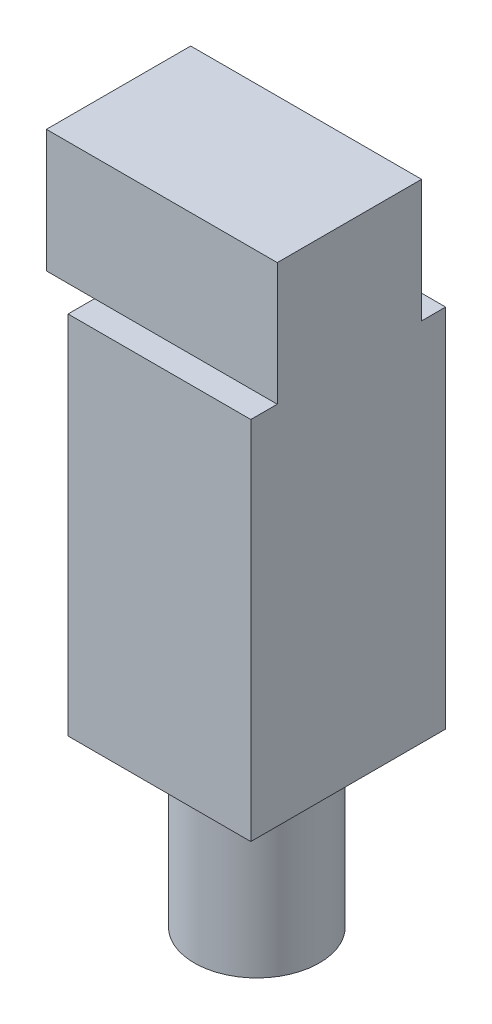
ISO-10303-21;
HEADER;
FILE_DESCRIPTION(('STEP AP214'),'2;1');
FILE_NAME('part.step','',(''),(''),'','','');
FILE_SCHEMA(('AUTOMOTIVE_DESIGN { 1 0 10303 214 1 1 1 1 }'));
ENDSEC;
DATA;
#1=APPLICATION_CONTEXT('core data for automotive mechanical design processes');
#2=APPLICATION_PROTOCOL_DEFINITION('international standard','automotive_design',2000,#1);
#3=PRODUCT_CONTEXT('',#1,'mechanical');
#4=PRODUCT('Part','Part','',(#3));
#5=PRODUCT_RELATED_PRODUCT_CATEGORY('part','',(#4));
#6=PRODUCT_DEFINITION_FORMATION('','',#4);
#7=PRODUCT_DEFINITION_CONTEXT('part definition',#1,'design');
#8=PRODUCT_DEFINITION('design','',#6,#7);
#9=PRODUCT_DEFINITION_SHAPE('','',#8);
#10=(LENGTH_UNIT() NAMED_UNIT(*) SI_UNIT(.MILLI.,.METRE.));
#11=(NAMED_UNIT(*) PLANE_ANGLE_UNIT() SI_UNIT($,.RADIAN.));
#12=(NAMED_UNIT(*) SI_UNIT($,.STERADIAN.) SOLID_ANGLE_UNIT());
#13=UNCERTAINTY_MEASURE_WITH_UNIT(LENGTH_MEASURE(1.E-05),#10,'distance_accuracy_value','');
#14=(GEOMETRIC_REPRESENTATION_CONTEXT(3) GLOBAL_UNCERTAINTY_ASSIGNED_CONTEXT((#13)) GLOBAL_UNIT_ASSIGNED_CONTEXT((#10,
#11,#12)) REPRESENTATION_CONTEXT('',''));
#15=CARTESIAN_POINT('',(0.,0.,0.));
#16=DIRECTION('',(0.,0.,1.));
#17=DIRECTION('',(1.,0.,0.));
#18=AXIS2_PLACEMENT_3D('',#15,#16,#17);
#19=CARTESIAN_POINT('',(19.0000000000004,38.,20.2499999999998));
#20=DIRECTION('',(0.,-1.,0.));
#21=DIRECTION('',(0.,0.,-1.));
#22=AXIS2_PLACEMENT_3D('',#19,#20,#21);
#23=PLANE('',#22);
#24=DIRECTION('',(-1.,0.,0.));
#25=VECTOR('',#24,1.);
#26=CARTESIAN_POINT('',(19.0000000000003,38.,-15.25));
#27=LINE('',#26,#25);
#28=CARTESIAN_POINT('',(19.0000000000003,38.,-15.25));
#29=VERTEX_POINT('',#28);
#30=CARTESIAN_POINT('',(-19.,38.000000000002,-15.25));
#31=VERTEX_POINT('',#30);
#32=EDGE_CURVE('E195',#29,#31,#27,.T.);
#33=ORIENTED_EDGE('',*,*,#32,.F.);
#34=DIRECTION('',(0.,0.,1.));
#35=VECTOR('',#34,1.);
#36=CARTESIAN_POINT('',(19.0000000000004,38.,20.2499999999998));
#37=LINE('',#36,#35);
#38=CARTESIAN_POINT('',(19.0000000000003,38.,-20.25));
#39=VERTEX_POINT('',#38);
#40=EDGE_CURVE('E104',#39,#29,#37,.T.);
#41=ORIENTED_EDGE('',*,*,#40,.F.);
#42=DIRECTION('',(-1.,0.,0.));
#43=VECTOR('',#42,1.);
#44=CARTESIAN_POINT('',(19.0000000000003,38.,-20.25));
#45=LINE('',#44,#43);
#46=CARTESIAN_POINT('',(-19.,38.000000000002,-20.25));
#47=VERTEX_POINT('',#46);
#48=EDGE_CURVE('E54',#39,#47,#45,.T.);
#49=ORIENTED_EDGE('',*,*,#48,.T.);
#50=DIRECTION('',(0.,0.,1.));
#51=VECTOR('',#50,1.);
#52=CARTESIAN_POINT('',(-19.,38.000000000002,20.25));
#53=LINE('',#52,#51);
#54=EDGE_CURVE('E167',#47,#31,#53,.T.);
#55=ORIENTED_EDGE('',*,*,#54,.T.);
#56=EDGE_LOOP('',(#33,#41,#49,#55));
#57=FACE_BOUND('',#56,.T.);
#58=ADVANCED_FACE('F50',(#57),#23,.F.);
#59=CARTESIAN_POINT('',(19.0000000000005,-38.,-20.25));
#60=DIRECTION('',(0.,0.,1.));
#61=DIRECTION('',(1.,0.,0.));
#62=AXIS2_PLACEMENT_3D('',#59,#60,#61);
#63=PLANE('',#62);
#64=DIRECTION('',(0.,1.,0.));
#65=VECTOR('',#64,1.);
#66=CARTESIAN_POINT('',(-18.9999999999999,-37.999999999998,-20.25));
#67=LINE('',#66,#65);
#68=CARTESIAN_POINT('',(-18.9999999999999,-37.999999999998,-20.25));
#69=VERTEX_POINT('',#68);
#70=EDGE_CURVE('E162',#69,#47,#67,.T.);
#71=ORIENTED_EDGE('',*,*,#70,.T.);
#72=ORIENTED_EDGE('',*,*,#48,.F.);
#73=DIRECTION('',(0.,1.,0.));
#74=VECTOR('',#73,1.);
#75=CARTESIAN_POINT('',(19.0000000000005,-38.,-20.25));
#76=LINE('',#75,#74);
#77=CARTESIAN_POINT('',(19.0000000000005,-38.,-20.25));
#78=VERTEX_POINT('',#77);
#79=EDGE_CURVE('E154',#78,#39,#76,.T.);
#80=ORIENTED_EDGE('',*,*,#79,.F.);
#81=DIRECTION('',(-1.,0.,0.));
#82=VECTOR('',#81,1.);
#83=CARTESIAN_POINT('',(19.0000000000005,-38.,-20.25));
#84=LINE('',#83,#82);
#85=EDGE_CURVE('E161',#78,#69,#84,.T.);
#86=ORIENTED_EDGE('',*,*,#85,.T.);
#87=EDGE_LOOP('',(#71,#72,#80,#86));
#88=FACE_BOUND('',#87,.T.);
#89=ADVANCED_FACE('F52',(#88),#63,.F.);
#90=CARTESIAN_POINT('',(19.0000000000004,38.,14.7499999999998));
#91=VERTEX_POINT('',#90);
#92=CARTESIAN_POINT('',(19.0000000000004,38.,20.2499999999998));
#93=VERTEX_POINT('',#92);
#94=EDGE_CURVE('E144',#91,#93,#37,.T.);
#95=ORIENTED_EDGE('',*,*,#94,.F.);
#96=DIRECTION('',(-1.,0.,0.));
#97=VECTOR('',#96,1.);
#98=CARTESIAN_POINT('',(19.0000000000004,38.,14.7499999999998));
#99=LINE('',#98,#97);
#100=CARTESIAN_POINT('',(-19.,38.000000000002,14.75));
#101=VERTEX_POINT('',#100);
#102=EDGE_CURVE('E132',#91,#101,#99,.T.);
#103=ORIENTED_EDGE('',*,*,#102,.T.);
#104=CARTESIAN_POINT('',(-19.,38.000000000002,20.25));
#105=VERTEX_POINT('',#104);
#106=EDGE_CURVE('E165',#101,#105,#53,.T.);
#107=ORIENTED_EDGE('',*,*,#106,.T.);
#108=DIRECTION('',(-1.,0.,0.));
#109=VECTOR('',#108,1.);
#110=CARTESIAN_POINT('',(19.0000000000004,38.,20.2499999999998));
#111=LINE('',#110,#109);
#112=EDGE_CURVE('E152',#93,#105,#111,.T.);
#113=ORIENTED_EDGE('',*,*,#112,.F.);
#114=EDGE_LOOP('',(#95,#103,#107,#113));
#115=FACE_BOUND('',#114,.T.);
#116=ADVANCED_FACE('F150',(#115),#23,.F.);
#117=CARTESIAN_POINT('',(19.0000000000002,-38.,20.2499999999995));
#118=DIRECTION('',(0.,0.,-1.));
#119=DIRECTION('',(-1.,0.,0.));
#120=AXIS2_PLACEMENT_3D('',#117,#118,#119);
#121=PLANE('',#120);
#122=DIRECTION('',(0.,-1.,0.));
#123=VECTOR('',#122,1.);
#124=CARTESIAN_POINT('',(-19.,-37.999999999998,20.2499999999997));
#125=LINE('',#124,#123);
#126=CARTESIAN_POINT('',(-19.,-37.999999999998,20.2499999999997));
#127=VERTEX_POINT('',#126);
#128=EDGE_CURVE('E170',#105,#127,#125,.T.);
#129=ORIENTED_EDGE('',*,*,#128,.T.);
#130=DIRECTION('',(-1.,0.,0.));
#131=VECTOR('',#130,1.);
#132=CARTESIAN_POINT('',(19.0000000000002,-38.,20.2499999999995));
#133=LINE('',#132,#131);
#134=CARTESIAN_POINT('',(19.0000000000002,-38.,20.2499999999995));
#135=VERTEX_POINT('',#134);
#136=EDGE_CURVE('E175',#135,#127,#133,.T.);
#137=ORIENTED_EDGE('',*,*,#136,.F.);
#138=DIRECTION('',(0.,-1.,0.));
#139=VECTOR('',#138,1.);
#140=CARTESIAN_POINT('',(19.0000000000002,-38.,20.2499999999995));
#141=LINE('',#140,#139);
#142=EDGE_CURVE('E156',#93,#135,#141,.T.);
#143=ORIENTED_EDGE('',*,*,#142,.F.);
#144=ORIENTED_EDGE('',*,*,#112,.T.);
#145=EDGE_LOOP('',(#129,#137,#143,#144));
#146=FACE_BOUND('',#145,.T.);
#147=ADVANCED_FACE('F224',(#146),#121,.F.);
#148=CARTESIAN_POINT('',(19.0000000000002,-38.,20.2499999999995));
#149=DIRECTION('',(0.,1.,0.));
#150=DIRECTION('',(0.,0.,1.));
#151=AXIS2_PLACEMENT_3D('',#148,#149,#150);
#152=PLANE('',#151);
#153=CARTESIAN_POINT('',(0.,-38.,0.));
#154=DIRECTION('',(0.,-1.,0.));
#155=DIRECTION('',(0.,0.,-1.));
#156=AXIS2_PLACEMENT_3D('',#153,#154,#155);
#157=CIRCLE('',#156,13.);
#158=CARTESIAN_POINT('',(0.,-38.0000000000001,-13.));
#159=VERTEX_POINT('',#158);
#160=EDGE_CURVE('E13',#159,#159,#157,.T.);
#161=ORIENTED_EDGE('',*,*,#160,.F.);
#162=EDGE_LOOP('',(#161));
#163=FACE_BOUND('',#162,.T.);
#164=DIRECTION('',(0.,0.,-1.));
#165=VECTOR('',#164,1.);
#166=CARTESIAN_POINT('',(-19.,-37.999999999998,20.2499999999997));
#167=LINE('',#166,#165);
#168=EDGE_CURVE('E96',#127,#69,#167,.T.);
#169=ORIENTED_EDGE('',*,*,#168,.T.);
#170=ORIENTED_EDGE('',*,*,#85,.F.);
#171=DIRECTION('',(0.,0.,-1.));
#172=VECTOR('',#171,1.);
#173=CARTESIAN_POINT('',(19.0000000000002,-38.,20.2499999999995));
#174=LINE('',#173,#172);
#175=EDGE_CURVE('E75',#135,#78,#174,.T.);
#176=ORIENTED_EDGE('',*,*,#175,.F.);
#177=ORIENTED_EDGE('',*,*,#136,.T.);
#178=EDGE_LOOP('',(#169,#170,#176,#177));
#179=FACE_BOUND('',#178,.T.);
#180=ADVANCED_FACE('F222',(#163,#179),#152,.F.);
#181=CARTESIAN_POINT('',(19.0000000000003,0.,0.));
#182=DIRECTION('',(-1.,0.,0.));
#183=DIRECTION('',(0.,0.,1.));
#184=AXIS2_PLACEMENT_3D('',#181,#182,#183);
#185=PLANE('',#184);
#186=ORIENTED_EDGE('',*,*,#79,.T.);
#187=ORIENTED_EDGE('',*,*,#40,.T.);
#188=DIRECTION('',(0.,-1.,0.));
#189=VECTOR('',#188,1.);
#190=CARTESIAN_POINT('',(19.0000000000003,38.,-15.25));
#191=LINE('',#190,#189);
#192=CARTESIAN_POINT('',(19.0000000000002,63.5000000000001,-15.25));
#193=VERTEX_POINT('',#192);
#194=EDGE_CURVE('E196',#193,#29,#191,.T.);
#195=ORIENTED_EDGE('',*,*,#194,.F.);
#196=DIRECTION('',(0.,0.,-1.));
#197=VECTOR('',#196,1.);
#198=CARTESIAN_POINT('',(19.0000000000003,63.5000000000001,14.75));
#199=LINE('',#198,#197);
#200=CARTESIAN_POINT('',(19.0000000000003,63.5000000000001,14.75));
#201=VERTEX_POINT('',#200);
#202=EDGE_CURVE('E147',#201,#193,#199,.T.);
#203=ORIENTED_EDGE('',*,*,#202,.F.);
#204=DIRECTION('',(0.,-1.,0.));
#205=VECTOR('',#204,1.);
#206=CARTESIAN_POINT('',(19.0000000000004,38.,14.7499999999998));
#207=LINE('',#206,#205);
#208=EDGE_CURVE('E136',#201,#91,#207,.T.);
#209=ORIENTED_EDGE('',*,*,#208,.T.);
#210=ORIENTED_EDGE('',*,*,#94,.T.);
#211=ORIENTED_EDGE('',*,*,#142,.T.);
#212=ORIENTED_EDGE('',*,*,#175,.T.);
#213=EDGE_LOOP('',(#186,#187,#195,#203,#209,#210,#211,#212));
#214=FACE_BOUND('',#213,.T.);
#215=ADVANCED_FACE('F143',(#214),#185,.F.);
#216=CARTESIAN_POINT('',(-19.,1.99840144432528E-12,0.));
#217=DIRECTION('',(-1.,0.,0.));
#218=DIRECTION('',(0.,0.,1.));
#219=AXIS2_PLACEMENT_3D('',#216,#217,#218);
#220=PLANE('',#219);
#221=ORIENTED_EDGE('',*,*,#70,.F.);
#222=ORIENTED_EDGE('',*,*,#168,.F.);
#223=ORIENTED_EDGE('',*,*,#128,.F.);
#224=ORIENTED_EDGE('',*,*,#106,.F.);
#225=EDGE_CURVE('E171',#31,#101,#53,.T.);
#226=ORIENTED_EDGE('',*,*,#225,.F.);
#227=ORIENTED_EDGE('',*,*,#54,.F.);
#228=EDGE_LOOP('',(#221,#222,#223,#224,#226,#227));
#229=FACE_BOUND('',#228,.T.);
#230=ADVANCED_FACE('F183',(#229),#220,.T.);
#231=CARTESIAN_POINT('',(0.,-73.,0.));
#232=DIRECTION('',(0.,1.,0.));
#233=DIRECTION('',(0.,0.,1.));
#234=AXIS2_PLACEMENT_3D('',#231,#232,#233);
#235=CYLINDRICAL_SURFACE('',#234,13.);
#236=CARTESIAN_POINT('',(0.,-73.,0.));
#237=DIRECTION('',(0.,-1.,0.));
#238=DIRECTION('',(0.,0.,-1.));
#239=AXIS2_PLACEMENT_3D('',#236,#237,#238);
#240=CIRCLE('',#239,13.);
#241=CARTESIAN_POINT('',(0.,-73.,-13.));
#242=VERTEX_POINT('',#241);
#243=EDGE_CURVE('E166',#242,#242,#240,.T.);
#244=ORIENTED_EDGE('',*,*,#243,.F.);
#245=EDGE_LOOP('',(#244));
#246=FACE_BOUND('',#245,.T.);
#247=ORIENTED_EDGE('',*,*,#160,.T.);
#248=EDGE_LOOP('',(#247));
#249=FACE_BOUND('',#248,.T.);
#250=ADVANCED_FACE('F216',(#246,#249),#235,.T.);
#251=CARTESIAN_POINT('',(0.,-73.,0.));
#252=DIRECTION('',(0.,-1.,0.));
#253=DIRECTION('',(0.,0.,-1.));
#254=AXIS2_PLACEMENT_3D('',#251,#252,#253);
#255=PLANE('',#254);
#256=ORIENTED_EDGE('',*,*,#243,.T.);
#257=EDGE_LOOP('',(#256));
#258=FACE_BOUND('',#257,.T.);
#259=ADVANCED_FACE('F214',(#258),#255,.T.);
#260=CARTESIAN_POINT('',(19.0000000000003,63.5000000000001,14.75));
#261=DIRECTION('',(0.,1.,0.));
#262=DIRECTION('',(0.,0.,1.));
#263=AXIS2_PLACEMENT_3D('',#260,#261,#262);
#264=PLANE('',#263);
#265=DIRECTION('',(1.,0.,0.));
#266=VECTOR('',#265,1.);
#267=CARTESIAN_POINT('',(19.0000000000002,63.5000000000001,-15.25));
#268=LINE('',#267,#266);
#269=CARTESIAN_POINT('',(-29.,63.5000000000019,-15.25));
#270=VERTEX_POINT('',#269);
#271=EDGE_CURVE('E148',#270,#193,#268,.T.);
#272=ORIENTED_EDGE('',*,*,#271,.F.);
#273=DIRECTION('',(0.,0.,-1.));
#274=VECTOR('',#273,1.);
#275=CARTESIAN_POINT('',(-29.,63.5000000000019,14.75));
#276=LINE('',#275,#274);
#277=CARTESIAN_POINT('',(-29.,63.5000000000019,14.75));
#278=VERTEX_POINT('',#277);
#279=EDGE_CURVE('E207',#278,#270,#276,.T.);
#280=ORIENTED_EDGE('',*,*,#279,.F.);
#281=DIRECTION('',(1.,0.,0.));
#282=VECTOR('',#281,1.);
#283=CARTESIAN_POINT('',(19.0000000000003,63.5000000000001,14.75));
#284=LINE('',#283,#282);
#285=EDGE_CURVE('E210',#278,#201,#284,.T.);
#286=ORIENTED_EDGE('',*,*,#285,.T.);
#287=ORIENTED_EDGE('',*,*,#202,.T.);
#288=EDGE_LOOP('',(#272,#280,#286,#287));
#289=FACE_BOUND('',#288,.T.);
#290=ADVANCED_FACE('F270',(#289),#264,.T.);
#291=CARTESIAN_POINT('',(-29.,38.0000000000018,14.75));
#292=DIRECTION('',(-1.,0.,0.));
#293=DIRECTION('',(0.,-1.,0.));
#294=AXIS2_PLACEMENT_3D('',#291,#292,#293);
#295=PLANE('',#294);
#296=CARTESIAN_POINT('',(-29.,53.5000000000019,0.));
#297=DIRECTION('',(-1.,0.,0.));
#298=DIRECTION('',(0.,-1.,0.));
#299=AXIS2_PLACEMENT_3D('',#296,#297,#298);
#300=CIRCLE('',#299,4.5);
#301=CARTESIAN_POINT('',(-29.,49.0000000000019,0.));
#302=VERTEX_POINT('',#301);
#303=EDGE_CURVE('E326',#302,#302,#300,.T.);
#304=ORIENTED_EDGE('',*,*,#303,.F.);
#305=EDGE_LOOP('',(#304));
#306=FACE_BOUND('',#305,.T.);
#307=DIRECTION('',(0.,1.,0.));
#308=VECTOR('',#307,1.);
#309=CARTESIAN_POINT('',(-29.,38.0000000000018,-15.25));
#310=LINE('',#309,#308);
#311=CARTESIAN_POINT('',(-29.,38.0000000000018,-15.25));
#312=VERTEX_POINT('',#311);
#313=EDGE_CURVE('E200',#312,#270,#310,.T.);
#314=ORIENTED_EDGE('',*,*,#313,.F.);
#315=DIRECTION('',(0.,0.,-1.));
#316=VECTOR('',#315,1.);
#317=CARTESIAN_POINT('',(-29.,38.0000000000018,14.75));
#318=LINE('',#317,#316);
#319=CARTESIAN_POINT('',(-29.,38.0000000000018,14.75));
#320=VERTEX_POINT('',#319);
#321=EDGE_CURVE('E191',#320,#312,#318,.T.);
#322=ORIENTED_EDGE('',*,*,#321,.F.);
#323=DIRECTION('',(0.,1.,0.));
#324=VECTOR('',#323,1.);
#325=CARTESIAN_POINT('',(-29.,38.0000000000018,14.75));
#326=LINE('',#325,#324);
#327=EDGE_CURVE('E141',#320,#278,#326,.T.);
#328=ORIENTED_EDGE('',*,*,#327,.T.);
#329=ORIENTED_EDGE('',*,*,#279,.T.);
#330=EDGE_LOOP('',(#314,#322,#328,#329));
#331=FACE_BOUND('',#330,.T.);
#332=ADVANCED_FACE('F278',(#306,#331),#295,.T.);
#333=CARTESIAN_POINT('',(19.0000000000004,38.,14.7499999999998));
#334=DIRECTION('',(0.,-1.,0.));
#335=DIRECTION('',(0.,0.,-1.));
#336=AXIS2_PLACEMENT_3D('',#333,#334,#335);
#337=PLANE('',#336);
#338=EDGE_CURVE('E189',#31,#312,#27,.T.);
#339=ORIENTED_EDGE('',*,*,#338,.F.);
#340=ORIENTED_EDGE('',*,*,#225,.T.);
#341=EDGE_CURVE('E66',#101,#320,#99,.T.);
#342=ORIENTED_EDGE('',*,*,#341,.T.);
#343=ORIENTED_EDGE('',*,*,#321,.T.);
#344=EDGE_LOOP('',(#339,#340,#342,#343));
#345=FACE_BOUND('',#344,.T.);
#346=ADVANCED_FACE('F186',(#345),#337,.T.);
#347=CARTESIAN_POINT('',(0.,0.,14.7499999999998));
#348=DIRECTION('',(0.,0.,1.));
#349=DIRECTION('',(1.,0.,0.));
#350=AXIS2_PLACEMENT_3D('',#347,#348,#349);
#351=PLANE('',#350);
#352=ORIENTED_EDGE('',*,*,#208,.F.);
#353=ORIENTED_EDGE('',*,*,#285,.F.);
#354=ORIENTED_EDGE('',*,*,#327,.F.);
#355=ORIENTED_EDGE('',*,*,#341,.F.);
#356=ORIENTED_EDGE('',*,*,#102,.F.);
#357=EDGE_LOOP('',(#352,#353,#354,#355,#356));
#358=FACE_BOUND('',#357,.T.);
#359=ADVANCED_FACE('F134',(#358),#351,.T.);
#360=CARTESIAN_POINT('',(0.,0.,-15.25));
#361=DIRECTION('',(0.,0.,1.));
#362=DIRECTION('',(1.,0.,0.));
#363=AXIS2_PLACEMENT_3D('',#360,#361,#362);
#364=PLANE('',#363);
#365=ORIENTED_EDGE('',*,*,#194,.T.);
#366=ORIENTED_EDGE('',*,*,#32,.T.);
#367=ORIENTED_EDGE('',*,*,#338,.T.);
#368=ORIENTED_EDGE('',*,*,#313,.T.);
#369=ORIENTED_EDGE('',*,*,#271,.T.);
#370=EDGE_LOOP('',(#365,#366,#367,#368,#369));
#371=FACE_BOUND('',#370,.T.);
#372=ADVANCED_FACE('F198',(#371),#364,.F.);
#373=CARTESIAN_POINT('',(-34.,53.5000000000001,-4.9960036108132E-13));
#374=DIRECTION('',(1.,0.,0.));
#375=DIRECTION('',(0.,1.,0.));
#376=AXIS2_PLACEMENT_3D('',#373,#374,#375);
#377=CYLINDRICAL_SURFACE('',#376,4.5);
#378=CARTESIAN_POINT('',(-34.,53.5000000000001,-4.9960036108132E-13));
#379=DIRECTION('',(-1.,0.,0.));
#380=DIRECTION('',(0.,-1.,0.));
#381=AXIS2_PLACEMENT_3D('',#378,#379,#380);
#382=CIRCLE('',#381,4.5);
#383=CARTESIAN_POINT('',(-34.,49.0000000000001,-5.08593167580784E-13));
#384=VERTEX_POINT('',#383);
#385=EDGE_CURVE('E325',#384,#384,#382,.T.);
#386=ORIENTED_EDGE('',*,*,#385,.F.);
#387=EDGE_LOOP('',(#386));
#388=FACE_BOUND('',#387,.T.);
#389=ORIENTED_EDGE('',*,*,#303,.T.);
#390=EDGE_LOOP('',(#389));
#391=FACE_BOUND('',#390,.T.);
#392=ADVANCED_FACE('F305',(#388,#391),#377,.T.);
#393=CARTESIAN_POINT('',(-34.,53.5000000000001,-4.9960036108132E-13));
#394=DIRECTION('',(-1.,0.,0.));
#395=DIRECTION('',(0.,-1.,0.));
#396=AXIS2_PLACEMENT_3D('',#393,#394,#395);
#397=PLANE('',#396);
#398=ORIENTED_EDGE('',*,*,#385,.T.);
#399=EDGE_LOOP('',(#398));
#400=FACE_BOUND('',#399,.T.);
#401=ADVANCED_FACE('F312',(#400),#397,.T.);
#402=CLOSED_SHELL('',(#58,#89,#116,#147,#180,#215,#230,#250,#259,#290,#332,#346,#359,#372,#392,#401));
#403=MANIFOLD_SOLID_BREP('B2',#402);
#404=ADVANCED_BREP_SHAPE_REPRESENTATION('',(#18,#403),#14);
#405=SHAPE_DEFINITION_REPRESENTATION(#9,#404);
ENDSEC;
END-ISO-10303-21;
